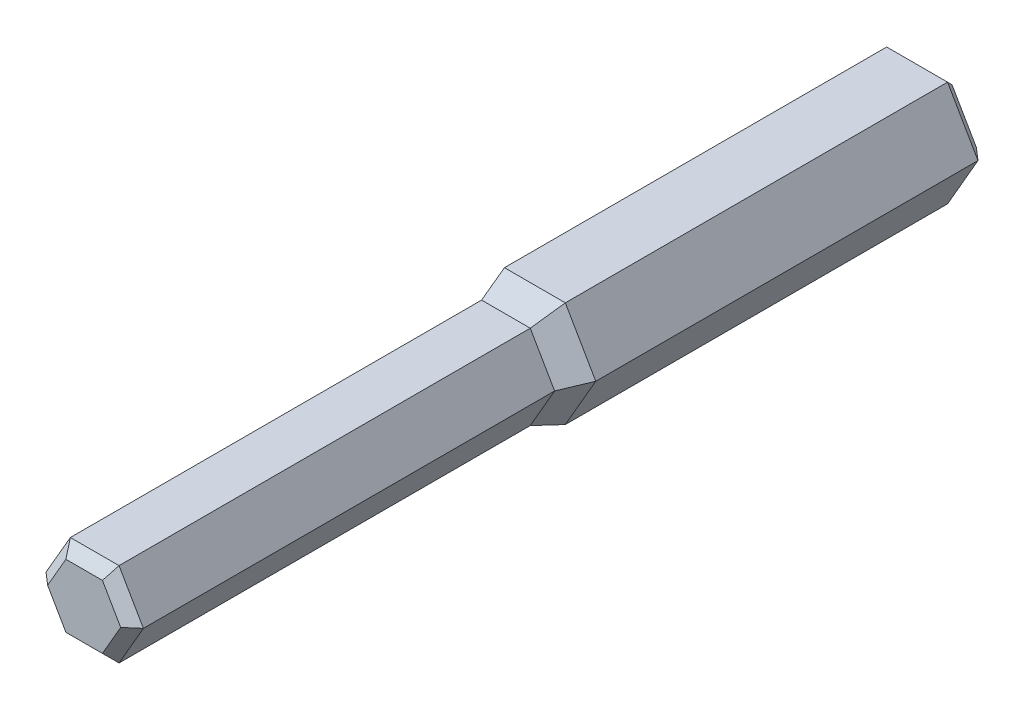
ISO-10303-21;
HEADER;
FILE_DESCRIPTION(('STEP AP214'),'2;1');
FILE_NAME('part.step','',(''),(''),'','','');
FILE_SCHEMA(('AUTOMOTIVE_DESIGN { 1 0 10303 214 1 1 1 1 }'));
ENDSEC;
DATA;
#1=APPLICATION_CONTEXT('core data for automotive mechanical design processes');
#2=APPLICATION_PROTOCOL_DEFINITION('international standard','automotive_design',2000,#1);
#3=PRODUCT_CONTEXT('',#1,'mechanical');
#4=PRODUCT('Part','Part','',(#3));
#5=PRODUCT_RELATED_PRODUCT_CATEGORY('part','',(#4));
#6=PRODUCT_DEFINITION_FORMATION('','',#4);
#7=PRODUCT_DEFINITION_CONTEXT('part definition',#1,'design');
#8=PRODUCT_DEFINITION('design','',#6,#7);
#9=PRODUCT_DEFINITION_SHAPE('','',#8);
#10=(LENGTH_UNIT() NAMED_UNIT(*) SI_UNIT(.MILLI.,.METRE.));
#11=(NAMED_UNIT(*) PLANE_ANGLE_UNIT() SI_UNIT($,.RADIAN.));
#12=(NAMED_UNIT(*) SI_UNIT($,.STERADIAN.) SOLID_ANGLE_UNIT());
#13=UNCERTAINTY_MEASURE_WITH_UNIT(LENGTH_MEASURE(1.E-05),#10,'distance_accuracy_value','');
#14=(GEOMETRIC_REPRESENTATION_CONTEXT(3) GLOBAL_UNCERTAINTY_ASSIGNED_CONTEXT((#13)) GLOBAL_UNIT_ASSIGNED_CONTEXT((#10,
#11,#12)) REPRESENTATION_CONTEXT('',''));
#15=CARTESIAN_POINT('',(0.,0.,0.));
#16=DIRECTION('',(0.,0.,1.));
#17=DIRECTION('',(1.,0.,0.));
#18=AXIS2_PLACEMENT_3D('',#15,#16,#17);
#19=CARTESIAN_POINT('',(1.15470053837927,-1.99999999999998,20.));
#20=DIRECTION('',(-0.866025403784441,0.499999999999995,0.));
#21=DIRECTION('',(-0.499999999999995,-0.866025403784441,0.));
#22=AXIS2_PLACEMENT_3D('',#19,#20,#21);
#23=PLANE('',#22);
#24=DIRECTION('',(0.,0.,-1.));
#25=VECTOR('',#24,1.);
#26=CARTESIAN_POINT('',(2.30940107675849,0.,20.));
#27=LINE('',#26,#25);
#28=CARTESIAN_POINT('',(2.30940107675849,0.,19.5));
#29=VERTEX_POINT('',#28);
#30=CARTESIAN_POINT('',(2.30940107675849,0.,0.));
#31=VERTEX_POINT('',#30);
#32=EDGE_CURVE('E169',#29,#31,#27,.T.);
#33=ORIENTED_EDGE('',*,*,#32,.F.);
#34=DIRECTION('',(-0.499999999999995,-0.866025403784441,0.));
#35=VECTOR('',#34,1.);
#36=CARTESIAN_POINT('',(1.15470053837927,-1.99999999999998,19.5));
#37=LINE('',#36,#35);
#38=CARTESIAN_POINT('',(1.15470053837927,-1.99999999999998,19.5));
#39=VERTEX_POINT('',#38);
#40=EDGE_CURVE('E278',#29,#39,#37,.T.);
#41=ORIENTED_EDGE('',*,*,#40,.T.);
#42=DIRECTION('',(0.,0.,-1.));
#43=VECTOR('',#42,1.);
#44=CARTESIAN_POINT('',(1.15470053837927,-1.99999999999998,20.));
#45=LINE('',#44,#43);
#46=CARTESIAN_POINT('',(1.15470053837927,-1.99999999999998,0.));
#47=VERTEX_POINT('',#46);
#48=EDGE_CURVE('E188',#39,#47,#45,.T.);
#49=ORIENTED_EDGE('',*,*,#48,.T.);
#50=DIRECTION('',(0.499999999999995,0.866025403784441,0.));
#51=VECTOR('',#50,1.);
#52=CARTESIAN_POINT('',(1.15470053837927,-1.99999999999998,0.));
#53=LINE('',#52,#51);
#54=EDGE_CURVE('E185',#47,#31,#53,.T.);
#55=ORIENTED_EDGE('',*,*,#54,.T.);
#56=EDGE_LOOP('',(#33,#41,#49,#55));
#57=FACE_BOUND('',#56,.T.);
#58=ADVANCED_FACE('F41',(#57),#23,.F.);
#59=CARTESIAN_POINT('',(2.30940107675849,0.,20.));
#60=DIRECTION('',(-0.866025403784438,-0.500000000000001,0.));
#61=DIRECTION('',(0.500000000000001,-0.866025403784438,0.));
#62=AXIS2_PLACEMENT_3D('',#59,#60,#61);
#63=PLANE('',#62);
#64=DIRECTION('',(0.,0.,-1.));
#65=VECTOR('',#64,1.);
#66=CARTESIAN_POINT('',(1.15470053837924,2.,20.));
#67=LINE('',#66,#65);
#68=CARTESIAN_POINT('',(1.15470053837924,2.,19.5));
#69=VERTEX_POINT('',#68);
#70=CARTESIAN_POINT('',(1.15470053837924,2.,0.));
#71=VERTEX_POINT('',#70);
#72=EDGE_CURVE('E182',#69,#71,#67,.T.);
#73=ORIENTED_EDGE('',*,*,#72,.F.);
#74=DIRECTION('',(0.500000000000001,-0.866025403784438,0.));
#75=VECTOR('',#74,1.);
#76=CARTESIAN_POINT('',(2.30940107675849,0.,19.5));
#77=LINE('',#76,#75);
#78=EDGE_CURVE('E177',#69,#29,#77,.T.);
#79=ORIENTED_EDGE('',*,*,#78,.T.);
#80=ORIENTED_EDGE('',*,*,#32,.T.);
#81=DIRECTION('',(-0.500000000000001,0.866025403784438,0.));
#82=VECTOR('',#81,1.);
#83=CARTESIAN_POINT('',(2.30940107675849,0.,0.));
#84=LINE('',#83,#82);
#85=EDGE_CURVE('E174',#31,#71,#84,.T.);
#86=ORIENTED_EDGE('',*,*,#85,.T.);
#87=EDGE_LOOP('',(#73,#79,#80,#86));
#88=FACE_BOUND('',#87,.T.);
#89=ADVANCED_FACE('F172',(#88),#63,.F.);
#90=CARTESIAN_POINT('',(1.15470053837924,2.,20.));
#91=DIRECTION('',(0.,-1.,0.));
#92=DIRECTION('',(1.,0.,0.));
#93=AXIS2_PLACEMENT_3D('',#90,#91,#92);
#94=PLANE('',#93);
#95=DIRECTION('',(0.,0.,-1.));
#96=VECTOR('',#95,1.);
#97=CARTESIAN_POINT('',(-1.15470053837926,1.99999999999999,20.));
#98=LINE('',#97,#96);
#99=CARTESIAN_POINT('',(-1.15470053837926,1.99999999999999,19.5));
#100=VERTEX_POINT('',#99);
#101=CARTESIAN_POINT('',(-1.15470053837926,1.99999999999999,0.));
#102=VERTEX_POINT('',#101);
#103=EDGE_CURVE('E240',#100,#102,#98,.T.);
#104=ORIENTED_EDGE('',*,*,#103,.F.);
#105=DIRECTION('',(1.,0.,0.));
#106=VECTOR('',#105,1.);
#107=CARTESIAN_POINT('',(1.15470053837924,2.,19.5));
#108=LINE('',#107,#106);
#109=EDGE_CURVE('E273',#100,#69,#108,.T.);
#110=ORIENTED_EDGE('',*,*,#109,.T.);
#111=ORIENTED_EDGE('',*,*,#72,.T.);
#112=DIRECTION('',(-1.,0.,0.));
#113=VECTOR('',#112,1.);
#114=CARTESIAN_POINT('',(1.15470053837924,2.,0.));
#115=LINE('',#114,#113);
#116=EDGE_CURVE('E213',#71,#102,#115,.T.);
#117=ORIENTED_EDGE('',*,*,#116,.T.);
#118=EDGE_LOOP('',(#104,#110,#111,#117));
#119=FACE_BOUND('',#118,.T.);
#120=ADVANCED_FACE('F474',(#119),#94,.F.);
#121=CARTESIAN_POINT('',(-1.15470053837926,1.99999999999999,20.));
#122=DIRECTION('',(0.866025403784442,-0.499999999999995,0.));
#123=DIRECTION('',(0.499999999999995,0.866025403784442,0.));
#124=AXIS2_PLACEMENT_3D('',#121,#122,#123);
#125=PLANE('',#124);
#126=DIRECTION('',(0.,0.,-1.));
#127=VECTOR('',#126,1.);
#128=CARTESIAN_POINT('',(-2.30940107675849,0.,20.));
#129=LINE('',#128,#127);
#130=CARTESIAN_POINT('',(-2.30940107675849,0.,19.5));
#131=VERTEX_POINT('',#130);
#132=CARTESIAN_POINT('',(-2.30940107675849,0.,0.));
#133=VERTEX_POINT('',#132);
#134=EDGE_CURVE('E236',#131,#133,#129,.T.);
#135=ORIENTED_EDGE('',*,*,#134,.F.);
#136=DIRECTION('',(0.499999999999995,0.866025403784442,0.));
#137=VECTOR('',#136,1.);
#138=CARTESIAN_POINT('',(-1.15470053837926,1.99999999999999,19.5));
#139=LINE('',#138,#137);
#140=EDGE_CURVE('E270',#131,#100,#139,.T.);
#141=ORIENTED_EDGE('',*,*,#140,.T.);
#142=ORIENTED_EDGE('',*,*,#103,.T.);
#143=DIRECTION('',(-0.499999999999995,-0.866025403784442,0.));
#144=VECTOR('',#143,1.);
#145=CARTESIAN_POINT('',(-1.15470053837926,1.99999999999999,0.));
#146=LINE('',#145,#144);
#147=EDGE_CURVE('E217',#102,#133,#146,.T.);
#148=ORIENTED_EDGE('',*,*,#147,.T.);
#149=EDGE_LOOP('',(#135,#141,#142,#148));
#150=FACE_BOUND('',#149,.T.);
#151=ADVANCED_FACE('F695',(#150),#125,.F.);
#152=CARTESIAN_POINT('',(-2.30940107675849,0.,20.));
#153=DIRECTION('',(0.866025403784435,0.500000000000007,0.));
#154=DIRECTION('',(-0.500000000000007,0.866025403784435,0.));
#155=AXIS2_PLACEMENT_3D('',#152,#153,#154);
#156=PLANE('',#155);
#157=DIRECTION('',(0.,0.,-1.));
#158=VECTOR('',#157,1.);
#159=CARTESIAN_POINT('',(-1.15470053837923,-2.,20.));
#160=LINE('',#159,#158);
#161=CARTESIAN_POINT('',(-1.15470053837923,-2.,19.5));
#162=VERTEX_POINT('',#161);
#163=CARTESIAN_POINT('',(-1.15470053837923,-2.,0.));
#164=VERTEX_POINT('',#163);
#165=EDGE_CURVE('E233',#162,#164,#160,.T.);
#166=ORIENTED_EDGE('',*,*,#165,.F.);
#167=DIRECTION('',(-0.500000000000007,0.866025403784435,0.));
#168=VECTOR('',#167,1.);
#169=CARTESIAN_POINT('',(-2.30940107675849,0.,19.5));
#170=LINE('',#169,#168);
#171=EDGE_CURVE('E267',#162,#131,#170,.T.);
#172=ORIENTED_EDGE('',*,*,#171,.T.);
#173=ORIENTED_EDGE('',*,*,#134,.T.);
#174=DIRECTION('',(0.500000000000007,-0.866025403784435,0.));
#175=VECTOR('',#174,1.);
#176=CARTESIAN_POINT('',(-2.30940107675849,0.,0.));
#177=LINE('',#176,#175);
#178=EDGE_CURVE('E224',#133,#164,#177,.T.);
#179=ORIENTED_EDGE('',*,*,#178,.T.);
#180=EDGE_LOOP('',(#166,#172,#173,#179));
#181=FACE_BOUND('',#180,.T.);
#182=ADVANCED_FACE('F687',(#181),#156,.F.);
#183=CARTESIAN_POINT('',(-1.15470053837923,-2.,20.));
#184=DIRECTION('',(0.,1.,0.));
#185=DIRECTION('',(-1.,0.,0.));
#186=AXIS2_PLACEMENT_3D('',#183,#184,#185);
#187=PLANE('',#186);
#188=ORIENTED_EDGE('',*,*,#48,.F.);
#189=DIRECTION('',(-1.,0.,0.));
#190=VECTOR('',#189,1.);
#191=CARTESIAN_POINT('',(-1.15470053837923,-2.,19.5));
#192=LINE('',#191,#190);
#193=EDGE_CURVE('E263',#39,#162,#192,.T.);
#194=ORIENTED_EDGE('',*,*,#193,.T.);
#195=ORIENTED_EDGE('',*,*,#165,.T.);
#196=DIRECTION('',(1.,0.,0.));
#197=VECTOR('',#196,1.);
#198=CARTESIAN_POINT('',(-1.15470053837923,-2.,0.));
#199=LINE('',#198,#197);
#200=EDGE_CURVE('E228',#164,#47,#199,.T.);
#201=ORIENTED_EDGE('',*,*,#200,.T.);
#202=EDGE_LOOP('',(#188,#194,#195,#201));
#203=FACE_BOUND('',#202,.T.);
#204=ADVANCED_FACE('F680',(#203),#187,.F.);
#205=CARTESIAN_POINT('',(0.,0.,20.));
#206=DIRECTION('',(0.,0.,1.));
#207=DIRECTION('',(1.,0.,0.));
#208=AXIS2_PLACEMENT_3D('',#205,#206,#207);
#209=PLANE('',#208);
#210=DIRECTION('',(0.500000000000007,-0.866025403784435,0.));
#211=VECTOR('',#210,1.);
#212=CARTESIAN_POINT('',(-0.721687836487014,-1.75,20.));
#213=LINE('',#212,#211);
#214=CARTESIAN_POINT('',(-1.73205080756887,0.,20.));
#215=VERTEX_POINT('',#214);
#216=CARTESIAN_POINT('',(-0.866025403784422,-1.5,20.));
#217=VERTEX_POINT('',#216);
#218=EDGE_CURVE('E256',#215,#217,#213,.T.);
#219=ORIENTED_EDGE('',*,*,#218,.T.);
#220=DIRECTION('',(1.,0.,0.));
#221=VECTOR('',#220,1.);
#222=CARTESIAN_POINT('',(1.15470053837927,-1.49999999999998,20.));
#223=LINE('',#222,#221);
#224=CARTESIAN_POINT('',(0.866025403784456,-1.49999999999999,20.));
#225=VERTEX_POINT('',#224);
#226=EDGE_CURVE('E259',#217,#225,#223,.T.);
#227=ORIENTED_EDGE('',*,*,#226,.T.);
#228=DIRECTION('',(0.499999999999995,0.866025403784441,0.));
#229=VECTOR('',#228,1.);
#230=CARTESIAN_POINT('',(1.87638837486628,0.249999999999996,20.));
#231=LINE('',#230,#229);
#232=CARTESIAN_POINT('',(1.73205080756887,0.,20.));
#233=VERTEX_POINT('',#232);
#234=EDGE_CURVE('E181',#225,#233,#231,.T.);
#235=ORIENTED_EDGE('',*,*,#234,.T.);
#236=DIRECTION('',(-0.500000000000001,0.866025403784438,0.));
#237=VECTOR('',#236,1.);
#238=CARTESIAN_POINT('',(0.721687836487027,1.75,20.));
#239=LINE('',#238,#237);
#240=CARTESIAN_POINT('',(0.866025403784433,1.5,20.));
#241=VERTEX_POINT('',#240);
#242=EDGE_CURVE('E247',#233,#241,#239,.T.);
#243=ORIENTED_EDGE('',*,*,#242,.T.);
#244=DIRECTION('',(-1.,0.,0.));
#245=VECTOR('',#244,1.);
#246=CARTESIAN_POINT('',(-1.15470053837925,1.49999999999999,20.));
#247=LINE('',#246,#245);
#248=CARTESIAN_POINT('',(-0.866025403784444,1.49999999999999,20.));
#249=VERTEX_POINT('',#248);
#250=EDGE_CURVE('E250',#241,#249,#247,.T.);
#251=ORIENTED_EDGE('',*,*,#250,.T.);
#252=DIRECTION('',(-0.499999999999995,-0.866025403784442,0.));
#253=VECTOR('',#252,1.);
#254=CARTESIAN_POINT('',(-1.87638837486628,-0.250000000000012,20.));
#255=LINE('',#254,#253);
#256=EDGE_CURVE('E253',#249,#215,#255,.T.);
#257=ORIENTED_EDGE('',*,*,#256,.T.);
#258=EDGE_LOOP('',(#219,#227,#235,#243,#251,#257));
#259=FACE_BOUND('',#258,.T.);
#260=ADVANCED_FACE('F520',(#259),#209,.T.);
#261=CARTESIAN_POINT('',(0.,1.49999999999999,20.));
#262=DIRECTION('',(0.,0.707106781186548,0.707106781186547));
#263=DIRECTION('',(1.,0.,0.));
#264=AXIS2_PLACEMENT_3D('',#261,#262,#263);
#265=PLANE('',#264);
#266=DIRECTION('',(-0.377964473009226,-0.654653670707978,0.654653670707977));
#267=VECTOR('',#266,1.);
#268=CARTESIAN_POINT('',(0.742307488958085,1.28571428571428,20.2142857142857));
#269=LINE('',#268,#267);
#270=EDGE_CURVE('E297',#69,#241,#269,.T.);
#271=ORIENTED_EDGE('',*,*,#270,.F.);
#272=ORIENTED_EDGE('',*,*,#109,.F.);
#273=DIRECTION('',(0.37796447300923,-0.654653670707976,0.654653670707977));
#274=VECTOR('',#273,1.);
#275=CARTESIAN_POINT('',(-0.742307488958094,1.28571428571428,20.2142857142857));
#276=LINE('',#275,#274);
#277=EDGE_CURVE('E194',#249,#100,#276,.F.);
#278=ORIENTED_EDGE('',*,*,#277,.F.);
#279=ORIENTED_EDGE('',*,*,#250,.F.);
#280=EDGE_LOOP('',(#271,#272,#278,#279));
#281=FACE_BOUND('',#280,.T.);
#282=ADVANCED_FACE('F514',(#281),#265,.T.);
#283=CARTESIAN_POINT('',(-1.29903810567666,0.74999999999999,20.));
#284=DIRECTION('',(-0.612372435695797,0.35355339059327,0.707106781186547));
#285=DIRECTION('',(0.499999999999995,0.866025403784442,0.));
#286=AXIS2_PLACEMENT_3D('',#283,#284,#285);
#287=PLANE('',#286);
#288=ORIENTED_EDGE('',*,*,#277,.T.);
#289=ORIENTED_EDGE('',*,*,#140,.F.);
#290=DIRECTION('',(0.755928946018454,0.,0.654653670707977));
#291=VECTOR('',#290,1.);
#292=CARTESIAN_POINT('',(-1.48461497791618,0.,20.2142857142857));
#293=LINE('',#292,#291);
#294=EDGE_CURVE('E293',#215,#131,#293,.F.);
#295=ORIENTED_EDGE('',*,*,#294,.F.);
#296=ORIENTED_EDGE('',*,*,#256,.F.);
#297=EDGE_LOOP('',(#288,#289,#295,#296));
#298=FACE_BOUND('',#297,.T.);
#299=ADVANCED_FACE('F507',(#298),#287,.T.);
#300=CARTESIAN_POINT('',(1.29903810567665,0.749999999999999,20.));
#301=DIRECTION('',(0.612372435695794,0.353553390593275,0.707106781186547));
#302=DIRECTION('',(0.500000000000001,-0.866025403784438,0.));
#303=AXIS2_PLACEMENT_3D('',#300,#301,#302);
#304=PLANE('',#303);
#305=ORIENTED_EDGE('',*,*,#270,.T.);
#306=ORIENTED_EDGE('',*,*,#242,.F.);
#307=DIRECTION('',(-0.755928946018454,0.,0.654653670707978));
#308=VECTOR('',#307,1.);
#309=CARTESIAN_POINT('',(1.48461497791618,0.,20.2142857142857));
#310=LINE('',#309,#308);
#311=EDGE_CURVE('E289',#29,#233,#310,.T.);
#312=ORIENTED_EDGE('',*,*,#311,.F.);
#313=ORIENTED_EDGE('',*,*,#78,.F.);
#314=EDGE_LOOP('',(#305,#306,#312,#313));
#315=FACE_BOUND('',#314,.T.);
#316=ADVANCED_FACE('F500',(#315),#304,.T.);
#317=CARTESIAN_POINT('',(-1.29903810567665,-0.750000000000008,20.));
#318=DIRECTION('',(-0.612372435695792,-0.353553390593279,0.707106781186547));
#319=DIRECTION('',(-0.500000000000007,0.866025403784435,0.));
#320=AXIS2_PLACEMENT_3D('',#317,#318,#319);
#321=PLANE('',#320);
#322=ORIENTED_EDGE('',*,*,#294,.T.);
#323=ORIENTED_EDGE('',*,*,#171,.F.);
#324=DIRECTION('',(0.377964473009221,0.654653670707981,0.654653670707977));
#325=VECTOR('',#324,1.);
#326=CARTESIAN_POINT('',(-0.742307488958076,-1.28571428571429,20.2142857142857));
#327=LINE('',#326,#325);
#328=EDGE_CURVE('E285',#217,#162,#327,.F.);
#329=ORIENTED_EDGE('',*,*,#328,.F.);
#330=ORIENTED_EDGE('',*,*,#218,.F.);
#331=EDGE_LOOP('',(#322,#323,#329,#330));
#332=FACE_BOUND('',#331,.T.);
#333=ADVANCED_FACE('F493',(#332),#321,.T.);
#334=CARTESIAN_POINT('',(1.29903810567666,-0.749999999999994,20.));
#335=DIRECTION('',(0.612372435695797,-0.35355339059327,0.707106781186547));
#336=DIRECTION('',(-0.499999999999995,-0.866025403784441,0.));
#337=AXIS2_PLACEMENT_3D('',#334,#335,#336);
#338=PLANE('',#337);
#339=ORIENTED_EDGE('',*,*,#311,.T.);
#340=ORIENTED_EDGE('',*,*,#234,.F.);
#341=DIRECTION('',(0.377964473009232,-0.654653670707974,-0.654653670707978));
#342=VECTOR('',#341,1.);
#343=CARTESIAN_POINT('',(0.742307488958108,-1.28571428571428,20.2142857142857));
#344=LINE('',#343,#342);
#345=EDGE_CURVE('E282',#39,#225,#344,.F.);
#346=ORIENTED_EDGE('',*,*,#345,.F.);
#347=ORIENTED_EDGE('',*,*,#40,.F.);
#348=EDGE_LOOP('',(#339,#340,#346,#347));
#349=FACE_BOUND('',#348,.T.);
#350=ADVANCED_FACE('F486',(#349),#338,.T.);
#351=CARTESIAN_POINT('',(0.,-1.49999999999999,20.));
#352=DIRECTION('',(0.,-0.707106781186548,0.707106781186547));
#353=DIRECTION('',(-1.,0.,0.));
#354=AXIS2_PLACEMENT_3D('',#351,#352,#353);
#355=PLANE('',#354);
#356=ORIENTED_EDGE('',*,*,#328,.T.);
#357=ORIENTED_EDGE('',*,*,#193,.F.);
#358=ORIENTED_EDGE('',*,*,#345,.T.);
#359=ORIENTED_EDGE('',*,*,#226,.F.);
#360=EDGE_LOOP('',(#356,#357,#358,#359));
#361=FACE_BOUND('',#360,.T.);
#362=ADVANCED_FACE('F479',(#361),#355,.T.);
#363=CARTESIAN_POINT('',(-1.44337567297406,-2.5,-20.));
#364=DIRECTION('',(0.866025403784439,0.5,0.));
#365=DIRECTION('',(-0.5,0.866025403784439,0.));
#366=AXIS2_PLACEMENT_3D('',#363,#364,#365);
#367=PLANE('',#366);
#368=DIRECTION('',(0.,0.,1.));
#369=VECTOR('',#368,1.);
#370=CARTESIAN_POINT('',(-2.88675134594813,0.,-20.));
#371=LINE('',#370,#369);
#372=CARTESIAN_POINT('',(-2.88675134594813,0.,-19.5));
#373=VERTEX_POINT('',#372);
#374=CARTESIAN_POINT('',(-2.88675134594813,0.,-1.3737387097273));
#375=VERTEX_POINT('',#374);
#376=EDGE_CURVE('E286',#373,#375,#371,.T.);
#377=ORIENTED_EDGE('',*,*,#376,.F.);
#378=DIRECTION('',(0.5,-0.866025403784439,0.));
#379=VECTOR('',#378,1.);
#380=CARTESIAN_POINT('',(-1.44337567297406,-2.5,-19.5));
#381=LINE('',#380,#379);
#382=CARTESIAN_POINT('',(-1.44337567297406,-2.5,-19.5));
#383=VERTEX_POINT('',#382);
#384=EDGE_CURVE('E11',#373,#383,#381,.T.);
#385=ORIENTED_EDGE('',*,*,#384,.T.);
#386=DIRECTION('',(0.,0.,1.));
#387=VECTOR('',#386,1.);
#388=CARTESIAN_POINT('',(-1.44337567297406,-2.5,-20.));
#389=LINE('',#388,#387);
#390=CARTESIAN_POINT('',(-1.44337567297406,-2.5,-1.3737387097273));
#391=VERTEX_POINT('',#390);
#392=EDGE_CURVE('E340',#383,#391,#389,.T.);
#393=ORIENTED_EDGE('',*,*,#392,.T.);
#394=DIRECTION('',(-0.5,0.866025403784439,0.));
#395=VECTOR('',#394,1.);
#396=CARTESIAN_POINT('',(-1.44337567297406,-2.5,-1.3737387097273));
#397=LINE('',#396,#395);
#398=EDGE_CURVE('E307',#391,#375,#397,.T.);
#399=ORIENTED_EDGE('',*,*,#398,.T.);
#400=EDGE_LOOP('',(#377,#385,#393,#399));
#401=FACE_BOUND('',#400,.T.);
#402=ADVANCED_FACE('F411',(#401),#367,.F.);
#403=CARTESIAN_POINT('',(-2.88675134594813,0.,-20.));
#404=DIRECTION('',(0.866025403784439,-0.5,0.));
#405=DIRECTION('',(0.5,0.866025403784439,0.));
#406=AXIS2_PLACEMENT_3D('',#403,#404,#405);
#407=PLANE('',#406);
#408=DIRECTION('',(0.,0.,1.));
#409=VECTOR('',#408,1.);
#410=CARTESIAN_POINT('',(-1.44337567297406,2.5,-20.));
#411=LINE('',#410,#409);
#412=CARTESIAN_POINT('',(-1.44337567297406,2.5,-19.5));
#413=VERTEX_POINT('',#412);
#414=CARTESIAN_POINT('',(-1.44337567297406,2.5,-1.3737387097273));
#415=VERTEX_POINT('',#414);
#416=EDGE_CURVE('E440',#413,#415,#411,.T.);
#417=ORIENTED_EDGE('',*,*,#416,.F.);
#418=DIRECTION('',(-0.5,-0.866025403784439,0.));
#419=VECTOR('',#418,1.);
#420=CARTESIAN_POINT('',(-2.88675134594813,0.,-19.5));
#421=LINE('',#420,#419);
#422=EDGE_CURVE('E52',#413,#373,#421,.T.);
#423=ORIENTED_EDGE('',*,*,#422,.T.);
#424=ORIENTED_EDGE('',*,*,#376,.T.);
#425=DIRECTION('',(0.5,0.866025403784439,0.));
#426=VECTOR('',#425,1.);
#427=CARTESIAN_POINT('',(-2.88675134594813,0.,-1.3737387097273));
#428=LINE('',#427,#426);
#429=EDGE_CURVE('E281',#375,#415,#428,.T.);
#430=ORIENTED_EDGE('',*,*,#429,.T.);
#431=EDGE_LOOP('',(#417,#423,#424,#430));
#432=FACE_BOUND('',#431,.T.);
#433=ADVANCED_FACE('F446',(#432),#407,.F.);
#434=CARTESIAN_POINT('',(-1.44337567297406,2.5,-20.));
#435=DIRECTION('',(0.,-1.,0.));
#436=DIRECTION('',(0.,0.,-1.));
#437=AXIS2_PLACEMENT_3D('',#434,#435,#436);
#438=PLANE('',#437);
#439=DIRECTION('',(0.,0.,1.));
#440=VECTOR('',#439,1.);
#441=CARTESIAN_POINT('',(1.44337567297407,2.5,-20.));
#442=LINE('',#441,#440);
#443=CARTESIAN_POINT('',(1.44337567297407,2.5,-19.5));
#444=VERTEX_POINT('',#443);
#445=CARTESIAN_POINT('',(1.44337567297407,2.5,-1.3737387097273));
#446=VERTEX_POINT('',#445);
#447=EDGE_CURVE('E436',#444,#446,#442,.T.);
#448=ORIENTED_EDGE('',*,*,#447,.F.);
#449=DIRECTION('',(-1.,0.,0.));
#450=VECTOR('',#449,1.);
#451=CARTESIAN_POINT('',(-1.44337567297406,2.5,-19.5));
#452=LINE('',#451,#450);
#453=EDGE_CURVE('E67',#444,#413,#452,.T.);
#454=ORIENTED_EDGE('',*,*,#453,.T.);
#455=ORIENTED_EDGE('',*,*,#416,.T.);
#456=DIRECTION('',(1.,0.,0.));
#457=VECTOR('',#456,1.);
#458=CARTESIAN_POINT('',(-1.44337567297406,2.5,-1.3737387097273));
#459=LINE('',#458,#457);
#460=EDGE_CURVE('E321',#415,#446,#459,.T.);
#461=ORIENTED_EDGE('',*,*,#460,.T.);
#462=EDGE_LOOP('',(#448,#454,#455,#461));
#463=FACE_BOUND('',#462,.T.);
#464=ADVANCED_FACE('F460',(#463),#438,.F.);
#465=CARTESIAN_POINT('',(1.44337567297407,2.5,-20.));
#466=DIRECTION('',(-0.866025403784439,-0.5,0.));
#467=DIRECTION('',(0.5,-0.866025403784439,0.));
#468=AXIS2_PLACEMENT_3D('',#465,#466,#467);
#469=PLANE('',#468);
#470=DIRECTION('',(0.,0.,1.));
#471=VECTOR('',#470,1.);
#472=CARTESIAN_POINT('',(2.88675134594813,0.,-20.));
#473=LINE('',#472,#471);
#474=CARTESIAN_POINT('',(2.88675134594813,0.,-19.5));
#475=VERTEX_POINT('',#474);
#476=CARTESIAN_POINT('',(2.88675134594813,0.,-1.3737387097273));
#477=VERTEX_POINT('',#476);
#478=EDGE_CURVE('E432',#475,#477,#473,.T.);
#479=ORIENTED_EDGE('',*,*,#478,.F.);
#480=DIRECTION('',(-0.5,0.866025403784439,0.));
#481=VECTOR('',#480,1.);
#482=CARTESIAN_POINT('',(1.44337567297407,2.5,-19.5));
#483=LINE('',#482,#481);
#484=EDGE_CURVE('E366',#475,#444,#483,.T.);
#485=ORIENTED_EDGE('',*,*,#484,.T.);
#486=ORIENTED_EDGE('',*,*,#447,.T.);
#487=DIRECTION('',(0.5,-0.866025403784439,0.));
#488=VECTOR('',#487,1.);
#489=CARTESIAN_POINT('',(1.44337567297407,2.5,-1.3737387097273));
#490=LINE('',#489,#488);
#491=EDGE_CURVE('E317',#446,#477,#490,.T.);
#492=ORIENTED_EDGE('',*,*,#491,.T.);
#493=EDGE_LOOP('',(#479,#485,#486,#492));
#494=FACE_BOUND('',#493,.T.);
#495=ADVANCED_FACE('F434',(#494),#469,.F.);
#496=CARTESIAN_POINT('',(2.88675134594813,0.,-20.));
#497=DIRECTION('',(-0.866025403784438,0.5,0.));
#498=DIRECTION('',(-0.5,-0.866025403784439,0.));
#499=AXIS2_PLACEMENT_3D('',#496,#497,#498);
#500=PLANE('',#499);
#501=DIRECTION('',(0.,0.,1.));
#502=VECTOR('',#501,1.);
#503=CARTESIAN_POINT('',(1.44337567297407,-2.5,-20.));
#504=LINE('',#503,#502);
#505=CARTESIAN_POINT('',(1.44337567297407,-2.5,-19.5));
#506=VERTEX_POINT('',#505);
#507=CARTESIAN_POINT('',(1.44337567297407,-2.5,-1.3737387097273));
#508=VERTEX_POINT('',#507);
#509=EDGE_CURVE('E419',#506,#508,#504,.T.);
#510=ORIENTED_EDGE('',*,*,#509,.F.);
#511=DIRECTION('',(0.5,0.866025403784439,0.));
#512=VECTOR('',#511,1.);
#513=CARTESIAN_POINT('',(2.88675134594813,0.,-19.5));
#514=LINE('',#513,#512);
#515=EDGE_CURVE('E363',#506,#475,#514,.T.);
#516=ORIENTED_EDGE('',*,*,#515,.T.);
#517=ORIENTED_EDGE('',*,*,#478,.T.);
#518=DIRECTION('',(-0.5,-0.866025403784439,0.));
#519=VECTOR('',#518,1.);
#520=CARTESIAN_POINT('',(2.88675134594813,0.,-1.3737387097273));
#521=LINE('',#520,#519);
#522=EDGE_CURVE('E201',#477,#508,#521,.T.);
#523=ORIENTED_EDGE('',*,*,#522,.T.);
#524=EDGE_LOOP('',(#510,#516,#517,#523));
#525=FACE_BOUND('',#524,.T.);
#526=ADVANCED_FACE('F431',(#525),#500,.F.);
#527=CARTESIAN_POINT('',(1.44337567297407,-2.5,-20.));
#528=DIRECTION('',(0.,1.,0.));
#529=DIRECTION('',(0.,0.,1.));
#530=AXIS2_PLACEMENT_3D('',#527,#528,#529);
#531=PLANE('',#530);
#532=ORIENTED_EDGE('',*,*,#392,.F.);
#533=DIRECTION('',(1.,0.,0.));
#534=VECTOR('',#533,1.);
#535=CARTESIAN_POINT('',(1.44337567297407,-2.5,-19.5));
#536=LINE('',#535,#534);
#537=EDGE_CURVE('E359',#383,#506,#536,.T.);
#538=ORIENTED_EDGE('',*,*,#537,.T.);
#539=ORIENTED_EDGE('',*,*,#509,.T.);
#540=DIRECTION('',(-1.,0.,0.));
#541=VECTOR('',#540,1.);
#542=CARTESIAN_POINT('',(1.44337567297407,-2.5,-1.3737387097273));
#543=LINE('',#542,#541);
#544=EDGE_CURVE('E311',#508,#391,#543,.T.);
#545=ORIENTED_EDGE('',*,*,#544,.T.);
#546=EDGE_LOOP('',(#532,#538,#539,#545));
#547=FACE_BOUND('',#546,.T.);
#548=ADVANCED_FACE('F414',(#547),#531,.F.);
#549=CARTESIAN_POINT('',(0.,0.,-20.));
#550=DIRECTION('',(0.,0.,-1.));
#551=DIRECTION('',(-1.,0.,0.));
#552=AXIS2_PLACEMENT_3D('',#549,#550,#551);
#553=PLANE('',#552);
#554=DIRECTION('',(-0.5,-0.866025403784439,0.));
#555=VECTOR('',#554,1.);
#556=CARTESIAN_POINT('',(1.01036297108184,-2.25,-20.));
#557=LINE('',#556,#555);
#558=CARTESIAN_POINT('',(2.3094010767585,0.,-20.));
#559=VERTEX_POINT('',#558);
#560=CARTESIAN_POINT('',(1.15470053837925,-2.,-20.));
#561=VERTEX_POINT('',#560);
#562=EDGE_CURVE('E352',#559,#561,#557,.T.);
#563=ORIENTED_EDGE('',*,*,#562,.T.);
#564=DIRECTION('',(-1.,0.,0.));
#565=VECTOR('',#564,1.);
#566=CARTESIAN_POINT('',(-1.44337567297406,-2.,-20.));
#567=LINE('',#566,#565);
#568=CARTESIAN_POINT('',(-1.15470053837925,-2.,-20.));
#569=VERTEX_POINT('',#568);
#570=EDGE_CURVE('E355',#561,#569,#567,.T.);
#571=ORIENTED_EDGE('',*,*,#570,.T.);
#572=DIRECTION('',(-0.5,0.866025403784439,0.));
#573=VECTOR('',#572,1.);
#574=CARTESIAN_POINT('',(-2.45373864405591,0.250000000000002,-20.));
#575=LINE('',#574,#573);
#576=CARTESIAN_POINT('',(-2.3094010767585,0.,-20.));
#577=VERTEX_POINT('',#576);
#578=EDGE_CURVE('E325',#569,#577,#575,.T.);
#579=ORIENTED_EDGE('',*,*,#578,.T.);
#580=DIRECTION('',(0.5,0.866025403784439,0.));
#581=VECTOR('',#580,1.);
#582=CARTESIAN_POINT('',(-1.01036297108184,2.25,-20.));
#583=LINE('',#582,#581);
#584=CARTESIAN_POINT('',(-1.15470053837925,2.,-20.));
#585=VERTEX_POINT('',#584);
#586=EDGE_CURVE('E343',#577,#585,#583,.T.);
#587=ORIENTED_EDGE('',*,*,#586,.T.);
#588=DIRECTION('',(1.,0.,0.));
#589=VECTOR('',#588,1.);
#590=CARTESIAN_POINT('',(1.44337567297407,2.,-20.));
#591=LINE('',#590,#589);
#592=CARTESIAN_POINT('',(1.15470053837925,2.,-20.));
#593=VERTEX_POINT('',#592);
#594=EDGE_CURVE('E346',#585,#593,#591,.T.);
#595=ORIENTED_EDGE('',*,*,#594,.T.);
#596=DIRECTION('',(0.5,-0.866025403784439,0.));
#597=VECTOR('',#596,1.);
#598=CARTESIAN_POINT('',(2.45373864405591,-0.250000000000001,-20.));
#599=LINE('',#598,#597);
#600=EDGE_CURVE('E349',#593,#559,#599,.T.);
#601=ORIENTED_EDGE('',*,*,#600,.T.);
#602=EDGE_LOOP('',(#563,#571,#579,#587,#595,#601));
#603=FACE_BOUND('',#602,.T.);
#604=ADVANCED_FACE('F553',(#603),#553,.T.);
#605=CARTESIAN_POINT('',(2.88675134594813,0.,-1.3737387097273));
#606=DIRECTION('',(-0.813797681349373,0.469846310392954,-0.34202014332567));
#607=DIRECTION('',(-0.5,-0.866025403784439,0.));
#608=AXIS2_PLACEMENT_3D('',#605,#606,#607);
#609=PLANE('',#608);
#610=DIRECTION('',(0.387449252410577,0.,-0.921891033043757));
#611=VECTOR('',#610,1.);
#612=CARTESIAN_POINT('',(2.6700762309089,0.,-0.858185138787072));
#613=LINE('',#612,#611);
#614=EDGE_CURVE('E198',#31,#477,#613,.T.);
#615=ORIENTED_EDGE('',*,*,#614,.F.);
#616=ORIENTED_EDGE('',*,*,#54,.F.);
#617=DIRECTION('',(0.193724626205288,-0.335540895264848,-0.921891033043757));
#618=VECTOR('',#617,1.);
#619=CARTESIAN_POINT('',(1.33503811545445,-2.31235384600811,-0.858185138787074));
#620=LINE('',#619,#618);
#621=EDGE_CURVE('E205',#508,#47,#620,.F.);
#622=ORIENTED_EDGE('',*,*,#621,.F.);
#623=ORIENTED_EDGE('',*,*,#522,.F.);
#624=EDGE_LOOP('',(#615,#616,#622,#623));
#625=FACE_BOUND('',#624,.T.);
#626=ADVANCED_FACE('F199',(#625),#609,.F.);
#627=CARTESIAN_POINT('',(1.44337567297407,-2.5,-1.3737387097273));
#628=DIRECTION('',(0.,0.939692620785908,-0.34202014332567));
#629=DIRECTION('',(-1.,0.,0.));
#630=AXIS2_PLACEMENT_3D('',#627,#628,#629);
#631=PLANE('',#630);
#632=ORIENTED_EDGE('',*,*,#621,.T.);
#633=ORIENTED_EDGE('',*,*,#200,.F.);
#634=DIRECTION('',(-0.193724626205288,-0.335540895264848,-0.921891033043757));
#635=VECTOR('',#634,1.);
#636=CARTESIAN_POINT('',(-1.33503811545445,-2.31235384600811,-0.858185138787073));
#637=LINE('',#636,#635);
#638=EDGE_CURVE('E206',#391,#164,#637,.F.);
#639=ORIENTED_EDGE('',*,*,#638,.F.);
#640=ORIENTED_EDGE('',*,*,#544,.F.);
#641=EDGE_LOOP('',(#632,#633,#639,#640));
#642=FACE_BOUND('',#641,.T.);
#643=ADVANCED_FACE('F543',(#642),#631,.F.);
#644=CARTESIAN_POINT('',(1.44337567297407,2.5,-1.3737387097273));
#645=DIRECTION('',(-0.813797681349373,-0.469846310392954,-0.342020143325669));
#646=DIRECTION('',(0.5,-0.866025403784439,0.));
#647=AXIS2_PLACEMENT_3D('',#644,#645,#646);
#648=PLANE('',#647);
#649=ORIENTED_EDGE('',*,*,#614,.T.);
#650=ORIENTED_EDGE('',*,*,#491,.F.);
#651=DIRECTION('',(0.193724626205288,0.335540895264848,-0.921891033043757));
#652=VECTOR('',#651,1.);
#653=CARTESIAN_POINT('',(1.33503811545445,2.31235384600811,-0.858185138787074));
#654=LINE('',#653,#652);
#655=EDGE_CURVE('E210',#71,#446,#654,.T.);
#656=ORIENTED_EDGE('',*,*,#655,.F.);
#657=ORIENTED_EDGE('',*,*,#85,.F.);
#658=EDGE_LOOP('',(#649,#650,#656,#657));
#659=FACE_BOUND('',#658,.T.);
#660=ADVANCED_FACE('F208',(#659),#648,.F.);
#661=CARTESIAN_POINT('',(-1.44337567297406,-2.5,-1.3737387097273));
#662=DIRECTION('',(0.813797681349374,0.469846310392954,-0.34202014332567));
#663=DIRECTION('',(-0.5,0.866025403784439,0.));
#664=AXIS2_PLACEMENT_3D('',#661,#662,#663);
#665=PLANE('',#664);
#666=ORIENTED_EDGE('',*,*,#638,.T.);
#667=ORIENTED_EDGE('',*,*,#178,.F.);
#668=DIRECTION('',(-0.387449252410577,0.,-0.921891033043757));
#669=VECTOR('',#668,1.);
#670=CARTESIAN_POINT('',(-2.67007623090889,0.,-0.858185138787074));
#671=LINE('',#670,#669);
#672=EDGE_CURVE('E330',#375,#133,#671,.F.);
#673=ORIENTED_EDGE('',*,*,#672,.F.);
#674=ORIENTED_EDGE('',*,*,#398,.F.);
#675=EDGE_LOOP('',(#666,#667,#673,#674));
#676=FACE_BOUND('',#675,.T.);
#677=ADVANCED_FACE('F452',(#676),#665,.F.);
#678=CARTESIAN_POINT('',(-1.44337567297406,2.5,-1.3737387097273));
#679=DIRECTION('',(0.,-0.939692620785908,-0.34202014332567));
#680=DIRECTION('',(1.,0.,0.));
#681=AXIS2_PLACEMENT_3D('',#678,#679,#680);
#682=PLANE('',#681);
#683=ORIENTED_EDGE('',*,*,#655,.T.);
#684=ORIENTED_EDGE('',*,*,#460,.F.);
#685=DIRECTION('',(0.193724626205288,-0.335540895264848,0.921891033043757));
#686=VECTOR('',#685,1.);
#687=CARTESIAN_POINT('',(-1.44337567297406,2.5,-1.3737387097273));
#688=LINE('',#687,#686);
#689=EDGE_CURVE('E326',#102,#415,#688,.F.);
#690=ORIENTED_EDGE('',*,*,#689,.F.);
#691=ORIENTED_EDGE('',*,*,#116,.F.);
#692=EDGE_LOOP('',(#683,#684,#690,#691));
#693=FACE_BOUND('',#692,.T.);
#694=ADVANCED_FACE('F459',(#693),#682,.F.);
#695=CARTESIAN_POINT('',(-2.88675134594813,0.,-1.3737387097273));
#696=DIRECTION('',(0.813797681349373,-0.469846310392954,-0.34202014332567));
#697=DIRECTION('',(0.5,0.866025403784439,0.));
#698=AXIS2_PLACEMENT_3D('',#695,#696,#697);
#699=PLANE('',#698);
#700=ORIENTED_EDGE('',*,*,#672,.T.);
#701=ORIENTED_EDGE('',*,*,#147,.F.);
#702=ORIENTED_EDGE('',*,*,#689,.T.);
#703=ORIENTED_EDGE('',*,*,#429,.F.);
#704=EDGE_LOOP('',(#700,#701,#702,#703));
#705=FACE_BOUND('',#704,.T.);
#706=ADVANCED_FACE('F455',(#705),#699,.F.);
#707=CARTESIAN_POINT('',(0.,2.,-20.));
#708=DIRECTION('',(0.,0.707106781186549,-0.707106781186546));
#709=DIRECTION('',(-1.,0.,0.));
#710=AXIS2_PLACEMENT_3D('',#707,#708,#709);
#711=PLANE('',#710);
#712=DIRECTION('',(0.377964473009226,-0.654653670707976,-0.654653670707978));
#713=VECTOR('',#712,1.);
#714=CARTESIAN_POINT('',(-0.989743318610787,1.71428571428571,-20.2857142857143));
#715=LINE('',#714,#713);
#716=EDGE_CURVE('E386',#413,#585,#715,.T.);
#717=ORIENTED_EDGE('',*,*,#716,.F.);
#718=ORIENTED_EDGE('',*,*,#453,.F.);
#719=DIRECTION('',(-0.377964473009227,-0.654653670707976,-0.654653670707979));
#720=VECTOR('',#719,1.);
#721=CARTESIAN_POINT('',(0.989743318610787,1.71428571428571,-20.2857142857143));
#722=LINE('',#721,#720);
#723=EDGE_CURVE('E46',#593,#444,#722,.F.);
#724=ORIENTED_EDGE('',*,*,#723,.F.);
#725=ORIENTED_EDGE('',*,*,#594,.F.);
#726=EDGE_LOOP('',(#717,#718,#724,#725));
#727=FACE_BOUND('',#726,.T.);
#728=ADVANCED_FACE('F44',(#727),#711,.T.);
#729=CARTESIAN_POINT('',(1.73205080756888,1.,-20.));
#730=DIRECTION('',(0.612372435695796,0.353553390593274,-0.707106781186546));
#731=DIRECTION('',(-0.5,0.866025403784439,0.));
#732=AXIS2_PLACEMENT_3D('',#729,#730,#731);
#733=PLANE('',#732);
#734=ORIENTED_EDGE('',*,*,#723,.T.);
#735=ORIENTED_EDGE('',*,*,#484,.F.);
#736=DIRECTION('',(-0.755928946018454,0.,-0.654653670707978));
#737=VECTOR('',#736,1.);
#738=CARTESIAN_POINT('',(1.97948663722157,0.,-20.2857142857143));
#739=LINE('',#738,#737);
#740=EDGE_CURVE('E383',#559,#475,#739,.F.);
#741=ORIENTED_EDGE('',*,*,#740,.F.);
#742=ORIENTED_EDGE('',*,*,#600,.F.);
#743=EDGE_LOOP('',(#734,#735,#741,#742));
#744=FACE_BOUND('',#743,.T.);
#745=ADVANCED_FACE('F398',(#744),#733,.T.);
#746=CARTESIAN_POINT('',(-1.73205080756888,0.999999999999999,-20.));
#747=DIRECTION('',(-0.612372435695796,0.353553390593274,-0.707106781186546));
#748=DIRECTION('',(-0.5,-0.866025403784439,0.));
#749=AXIS2_PLACEMENT_3D('',#746,#747,#748);
#750=PLANE('',#749);
#751=ORIENTED_EDGE('',*,*,#716,.T.);
#752=ORIENTED_EDGE('',*,*,#586,.F.);
#753=DIRECTION('',(0.755928946018453,0.,-0.654653670707979));
#754=VECTOR('',#753,1.);
#755=CARTESIAN_POINT('',(-1.97948663722157,0.,-20.2857142857143));
#756=LINE('',#755,#754);
#757=EDGE_CURVE('E379',#373,#577,#756,.T.);
#758=ORIENTED_EDGE('',*,*,#757,.F.);
#759=ORIENTED_EDGE('',*,*,#422,.F.);
#760=EDGE_LOOP('',(#751,#752,#758,#759));
#761=FACE_BOUND('',#760,.T.);
#762=ADVANCED_FACE('F403',(#761),#750,.T.);
#763=CARTESIAN_POINT('',(1.73205080756888,-1.,-20.));
#764=DIRECTION('',(0.612372435695795,-0.353553390593274,-0.707106781186547));
#765=DIRECTION('',(0.5,0.866025403784439,0.));
#766=AXIS2_PLACEMENT_3D('',#763,#764,#765);
#767=PLANE('',#766);
#768=ORIENTED_EDGE('',*,*,#740,.T.);
#769=ORIENTED_EDGE('',*,*,#515,.F.);
#770=DIRECTION('',(-0.377964473009227,0.654653670707976,-0.654653670707978));
#771=VECTOR('',#770,1.);
#772=CARTESIAN_POINT('',(0.989743318610787,-1.71428571428571,-20.2857142857143));
#773=LINE('',#772,#771);
#774=EDGE_CURVE('E376',#561,#506,#773,.F.);
#775=ORIENTED_EDGE('',*,*,#774,.F.);
#776=ORIENTED_EDGE('',*,*,#562,.F.);
#777=EDGE_LOOP('',(#768,#769,#775,#776));
#778=FACE_BOUND('',#777,.T.);
#779=ADVANCED_FACE('F428',(#778),#767,.T.);
#780=CARTESIAN_POINT('',(-1.73205080756888,-0.999999999999998,-20.));
#781=DIRECTION('',(-0.612372435695796,-0.353553390593274,-0.707106781186546));
#782=DIRECTION('',(0.5,-0.866025403784439,0.));
#783=AXIS2_PLACEMENT_3D('',#780,#781,#782);
#784=PLANE('',#783);
#785=ORIENTED_EDGE('',*,*,#757,.T.);
#786=ORIENTED_EDGE('',*,*,#578,.F.);
#787=DIRECTION('',(-0.377964473009227,-0.654653670707976,0.654653670707978));
#788=VECTOR('',#787,1.);
#789=CARTESIAN_POINT('',(-0.989743318610787,-1.71428571428571,-20.2857142857143));
#790=LINE('',#789,#788);
#791=EDGE_CURVE('E373',#383,#569,#790,.F.);
#792=ORIENTED_EDGE('',*,*,#791,.F.);
#793=ORIENTED_EDGE('',*,*,#384,.F.);
#794=EDGE_LOOP('',(#785,#786,#792,#793));
#795=FACE_BOUND('',#794,.T.);
#796=ADVANCED_FACE('F408',(#795),#784,.T.);
#797=CARTESIAN_POINT('',(0.,-2.,-20.));
#798=DIRECTION('',(0.,-0.707106781186549,-0.707106781186546));
#799=DIRECTION('',(1.,0.,0.));
#800=AXIS2_PLACEMENT_3D('',#797,#798,#799);
#801=PLANE('',#800);
#802=ORIENTED_EDGE('',*,*,#774,.T.);
#803=ORIENTED_EDGE('',*,*,#537,.F.);
#804=ORIENTED_EDGE('',*,*,#791,.T.);
#805=ORIENTED_EDGE('',*,*,#570,.F.);
#806=EDGE_LOOP('',(#802,#803,#804,#805));
#807=FACE_BOUND('',#806,.T.);
#808=ADVANCED_FACE('F422',(#807),#801,.T.);
#809=CLOSED_SHELL('',(#58,#89,#120,#151,#182,#204,#260,#282,#299,#316,#333,#350,#362,#402,#433,
#464,#495,#526,#548,#604,#626,#643,#660,#677,#694,#706,#728,#745,#762,#779,#796,#808));
#810=MANIFOLD_SOLID_BREP('B2',#809);
#811=ADVANCED_BREP_SHAPE_REPRESENTATION('',(#18,#810),#14);
#812=SHAPE_DEFINITION_REPRESENTATION(#9,#811);
ENDSEC;
END-ISO-10303-21;
